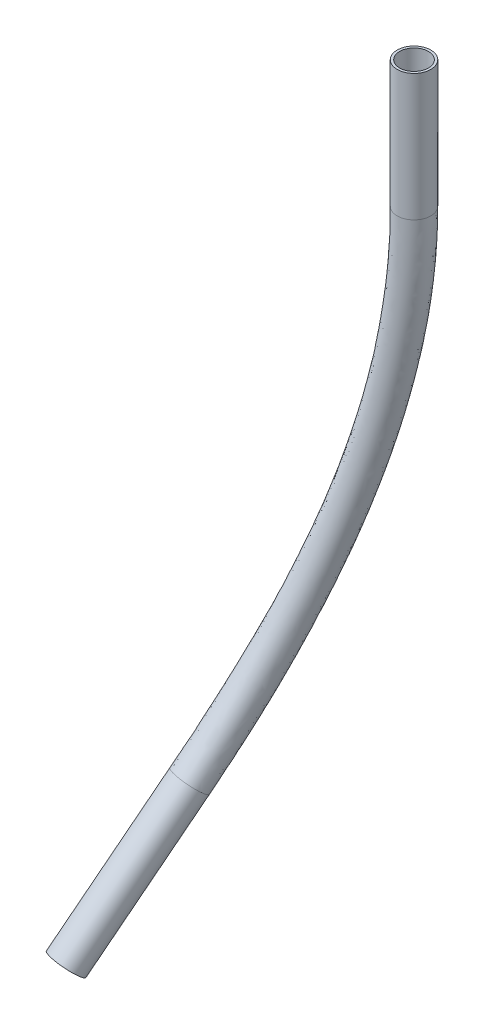
ISO-10303-21;
HEADER;
FILE_DESCRIPTION(('STEP AP214'),'2;1');
FILE_NAME('part.step','',(''),(''),'','','');
FILE_SCHEMA(('AUTOMOTIVE_DESIGN { 1 0 10303 214 1 1 1 1 }'));
ENDSEC;
DATA;
#1=APPLICATION_CONTEXT('core data for automotive mechanical design processes');
#2=APPLICATION_PROTOCOL_DEFINITION('international standard','automotive_design',2000,#1);
#3=PRODUCT_CONTEXT('',#1,'mechanical');
#4=PRODUCT('Part','Part','',(#3));
#5=PRODUCT_RELATED_PRODUCT_CATEGORY('part','',(#4));
#6=PRODUCT_DEFINITION_FORMATION('','',#4);
#7=PRODUCT_DEFINITION_CONTEXT('part definition',#1,'design');
#8=PRODUCT_DEFINITION('design','',#6,#7);
#9=PRODUCT_DEFINITION_SHAPE('','',#8);
#10=(LENGTH_UNIT() NAMED_UNIT(*) SI_UNIT(.MILLI.,.METRE.));
#11=(NAMED_UNIT(*) PLANE_ANGLE_UNIT() SI_UNIT($,.RADIAN.));
#12=(NAMED_UNIT(*) SI_UNIT($,.STERADIAN.) SOLID_ANGLE_UNIT());
#13=UNCERTAINTY_MEASURE_WITH_UNIT(LENGTH_MEASURE(1.E-05),#10,'distance_accuracy_value','');
#14=(GEOMETRIC_REPRESENTATION_CONTEXT(3) GLOBAL_UNCERTAINTY_ASSIGNED_CONTEXT((#13)) GLOBAL_UNIT_ASSIGNED_CONTEXT((#10,
#11,#12)) REPRESENTATION_CONTEXT('',''));
#15=CARTESIAN_POINT('',(0.,0.,0.));
#16=DIRECTION('',(0.,0.,1.));
#17=DIRECTION('',(1.,0.,0.));
#18=AXIS2_PLACEMENT_3D('',#15,#16,#17);
#19=CARTESIAN_POINT('',(-25.4518355396997,26.7082026198357,-24.3345169161758));
#20=DIRECTION('',(0.154747082057597,0.766044443118977,-0.623882402189063));
#21=DIRECTION('',(0.,-0.63148924671694,-0.775384634411123));
#22=AXIS2_PLACEMENT_3D('',#19,#20,#21);
#23=CYLINDRICAL_SURFACE('',#22,0.53213);
#24=CARTESIAN_POINT('',(-25.2189271106867,27.8611691600034,-25.2735166585337));
#25=DIRECTION('',(-0.154747082057597,-0.766044443118977,0.623882402189063));
#26=DIRECTION('',(0.,-0.63148924671694,-0.775384634411123));
#27=AXIS2_PLACEMENT_3D('',#24,#25,#26);
#28=CIRCLE('',#27,0.53213);
#29=CARTESIAN_POINT('',(-25.2189271106867,27.525134787148,-25.6861220840429));
#30=VERTEX_POINT('',#29);
#31=EDGE_CURVE('E42',#30,#30,#28,.F.);
#32=ORIENTED_EDGE('',*,*,#31,.T.);
#33=EDGE_LOOP('',(#32));
#34=FACE_BOUND('',#33,.T.);
#35=CARTESIAN_POINT('',(-23.930062277599,31.6959375525582,-28.2595744534185));
#36=CARTESIAN_POINT('',(-23.9282613133762,31.6900721088952,-28.2663297274114));
#37=CARTESIAN_POINT('',(-23.9266839689285,31.6842045714282,-28.2731430387115));
#38=CARTESIAN_POINT('',(-23.923997563247,31.6725423556797,-28.2867963523781));
#39=CARTESIAN_POINT('',(-23.9228837520355,31.6667475600735,-28.2936353206246));
#40=CARTESIAN_POINT('',(-23.9211156868814,31.6552381836464,-28.3073287521148));
#41=CARTESIAN_POINT('',(-23.9204572144324,31.6495233606438,-28.3141824663716));
#42=CARTESIAN_POINT('',(-23.9195905502066,31.6381813372569,-28.3278939930938));
#43=CARTESIAN_POINT('',(-23.9193786519351,31.6325538035448,-28.3347512954867));
#44=CARTESIAN_POINT('',(-23.9193960390649,31.6213937083077,-28.3484587177808));
#45=CARTESIAN_POINT('',(-23.9196220978129,31.6158607528798,-28.355308521007));
#46=CARTESIAN_POINT('',(-23.9205062960174,31.6048971403361,-28.3689896915733));
#47=CARTESIAN_POINT('',(-23.9211616542646,31.5994660546623,-28.3758208952778));
#48=CARTESIAN_POINT('',(-23.9228953963299,31.5887134809121,-28.3894536582254));
#49=CARTESIAN_POINT('',(-23.9239714074073,31.5833915513149,-28.3962551710652));
#50=CARTESIAN_POINT('',(-23.9265374361815,31.5728645687016,-28.4098173776115));
#51=CARTESIAN_POINT('',(-23.9280254520575,31.5676590788799,-28.4165781111274));
#52=CARTESIAN_POINT('',(-23.9314065113993,31.5573722380025,-28.4300476148822));
#53=CARTESIAN_POINT('',(-23.9332978870446,31.5522904689683,-28.4367564846585));
#54=CARTESIAN_POINT('',(-23.9374767248168,31.5422583187773,-28.450111142249));
#55=CARTESIAN_POINT('',(-23.9397628179298,31.5373075495392,-28.4567570670066));
#56=CARTESIAN_POINT('',(-23.9447221856284,31.5275446379431,-28.4699747372408));
#57=CARTESIAN_POINT('',(-23.9473943573581,31.5227321460153,-28.4765466383915));
#58=CARTESIAN_POINT('',(-23.9531170104835,31.5132530203317,-28.489605181796));
#59=CARTESIAN_POINT('',(-23.9561666256673,31.5085860822851,-28.4960919828242));
#60=CARTESIAN_POINT('',(-23.9626353237617,31.4994052897012,-28.5089692610885));
#61=CARTESIAN_POINT('',(-23.9660537510958,31.4948911816795,-28.5153598869611));
#62=CARTESIAN_POINT('',(-23.9732512577515,31.4860232696688,-28.5280337624273));
#63=CARTESIAN_POINT('',(-23.9770298698093,31.4816692678752,-28.5343171389991));
#64=CARTESIAN_POINT('',(-23.9849389525844,31.473128784582,-28.5467654741697));
#65=CARTESIAN_POINT('',(-23.9890691257289,31.4689421657304,-28.5529305276089));
#66=CARTESIAN_POINT('',(-23.9976725560024,31.4607436603178,-28.5651311846831));
#67=CARTESIAN_POINT('',(-24.0021456702033,31.4567317020446,-28.5711668409194));
#68=CARTESIAN_POINT('',(-24.0114262229725,31.4488897250102,-28.5830976813551));
#69=CARTESIAN_POINT('',(-24.0162336615408,31.445059706249,-28.5889928655545));
#70=CARTESIAN_POINT('',(-24.0261741151674,31.4375888097102,-28.6006317496555));
#71=CARTESIAN_POINT('',(-24.0313072644159,31.4339480110282,-28.6063753857226));
#72=CARTESIAN_POINT('',(-24.0418904003217,31.4268627489788,-28.6177001722475));
#73=CARTESIAN_POINT('',(-24.0473406491539,31.4234184528743,-28.6232811823583));
#74=CARTESIAN_POINT('',(-24.0585492514655,31.4167333814147,-28.6342697281501));
#75=CARTESIAN_POINT('',(-24.0643079908945,31.4134928725741,-28.6396770323173));
#76=CARTESIAN_POINT('',(-24.0761248460329,31.4072225501135,-28.6503071919531));
#77=CARTESIAN_POINT('',(-24.0821834686269,31.4041931156212,-28.6555297076305));
#78=CARTESIAN_POINT('',(-24.094591364837,31.3983521030498,-28.6657793330938));
#79=CARTESIAN_POINT('',(-24.1009412640901,31.3955410325448,-28.6708059748284));
#80=CARTESIAN_POINT('',(-24.1139229909064,31.3901438933699,-28.6806529152085));
#81=CARTESIAN_POINT('',(-24.1205555605328,31.3875584791359,-28.6854725943544));
#82=CARTESIAN_POINT('',(-24.1340939081763,31.382619779576,-28.6948946955825));
#83=CARTESIAN_POINT('',(-24.1410005413301,31.3802673165525,-28.6994963200939));
#84=CARTESIAN_POINT('',(-24.1550783000408,31.3758016255784,-28.708471424726));
#85=CARTESIAN_POINT('',(-24.1622503884749,31.3736894112764,-28.7128438990523));
#86=CARTESIAN_POINT('',(-24.1768503477705,31.3697113005897,-28.7213498461126));
#87=CARTESIAN_POINT('',(-24.1842792809324,31.3678466348964,-28.7254820712133));
#88=CARTESIAN_POINT('',(-24.1993842288562,31.3643706788322,-28.7334966961262));
#89=CARTESIAN_POINT('',(-24.2070613930192,31.3627608636904,-28.7373775696498));
#90=CARTESIAN_POINT('',(-24.2226541152021,31.3598016390377,-28.7448787042288));
#91=CARTESIAN_POINT('',(-24.2305708924026,31.3584539779913,-28.7484971208069));
#92=CARTESIAN_POINT('',(-24.2466341716963,31.3560260637141,-28.7554625935052));
#93=CARTESIAN_POINT('',(-24.2547819395292,31.354947861308,-28.7588074454386));
#94=CARTESIAN_POINT('',(-24.2712985534968,31.3530658381929,-28.7652150811599));
#95=CARTESIAN_POINT('',(-24.279668682043,31.3522643992721,-28.7682752585171));
#96=CARTESIAN_POINT('',(-24.296621408715,31.3509428493999,-28.7741028806916));
#97=CARTESIAN_POINT('',(-24.3052052689561,31.3504254781825,-28.7768672745344));
#98=CARTESIAN_POINT('',(-24.3225768617204,31.3496789846291,-28.7820926992586));
#99=CARTESIAN_POINT('',(-24.3313657914057,31.3494529841308,-28.7845501938821));
#100=CARTESIAN_POINT('',(-24.3490345374274,31.3492970519659,-28.7891241934834));
#101=CARTESIAN_POINT('',(-24.3579143537638,31.3493671202993,-28.7912406984612));
#102=CARTESIAN_POINT('',(-24.3756491514644,31.3498037890663,-28.7951034464794));
#103=CARTESIAN_POINT('',(-24.3845034120282,31.3501672634579,-28.7968533490961));
#104=CARTESIAN_POINT('',(-24.40217371256,31.3511832543742,-28.7999887689186));
#105=CARTESIAN_POINT('',(-24.4109893302912,31.3518330237527,-28.8013775545225));
#106=CARTESIAN_POINT('',(-24.4285690510586,31.3534141361364,-28.8037966131966));
#107=CARTESIAN_POINT('',(-24.4373329712136,31.3543430876497,-28.8048297773386));
#108=CARTESIAN_POINT('',(-24.4547960547394,31.3564751213744,-28.8065434474601));
#109=CARTESIAN_POINT('',(-24.4634952212953,31.3576761415626,-28.8072264861195));
#110=CARTESIAN_POINT('',(-24.48081561043,31.3603448977976,-28.8082457387745));
#111=CARTESIAN_POINT('',(-24.4894369750209,31.361810873367,-28.8085841496262));
#112=CARTESIAN_POINT('',(-24.5065886189907,31.365002155001,-28.8089199553709));
#113=CARTESIAN_POINT('',(-24.5151191382809,31.3667259735755,-28.8089192362108));
#114=CARTESIAN_POINT('',(-24.5320759904085,31.3704255856118,-28.8085825640211));
#115=CARTESIAN_POINT('',(-24.5405026262568,31.372400136333,-28.8082482120698));
#116=CARTESIAN_POINT('',(-24.5572386437664,31.3765938861729,-28.8072500289449));
#117=CARTESIAN_POINT('',(-24.5655483624472,31.378812060171,-28.8065875400766));
#118=CARTESIAN_POINT('',(-24.582037505642,31.3834857578092,-28.804938810595));
#119=CARTESIAN_POINT('',(-24.5902172771778,31.3859404485372,-28.8039536787616));
#120=CARTESIAN_POINT('',(-24.6064335087513,31.3910799066716,-28.8016653647756));
#121=CARTESIAN_POINT('',(-24.6144703061327,31.3937640101157,-28.8003630815546));
#122=CARTESIAN_POINT('',(-24.6303875904449,31.399355044182,-28.7974461419683));
#123=CARTESIAN_POINT('',(-24.6382683888456,31.4022614589597,-28.7958321962478));
#124=CARTESIAN_POINT('',(-24.6538606912337,31.4082898871022,-28.7922975868816));
#125=CARTESIAN_POINT('',(-24.6615724672279,31.4114115144654,-28.7903774646626));
#126=CARTESIAN_POINT('',(-24.6768137533491,31.4178631574543,-28.7862361381923));
#127=CARTESIAN_POINT('',(-24.6843434841541,31.4211929012118,-28.7840153224955));
#128=CARTESIAN_POINT('',(-24.6992077193704,31.4280535823168,-28.7792782284545));
#129=CARTESIAN_POINT('',(-24.7065423821253,31.4315843486901,-28.776762199319));
#130=CARTESIAN_POINT('',(-24.7210035309305,31.4388398935176,-28.7714402841561));
#131=CARTESIAN_POINT('',(-24.7281301020159,31.4425645909414,-28.7686345187152));
#132=CARTESIAN_POINT('',(-24.7421621275035,31.4502008272406,-28.7627387259009));
#133=CARTESIAN_POINT('',(-24.7490675819058,31.454112366116,-28.7596486985275));
#134=CARTESIAN_POINT('',(-24.7626444452746,31.4621151235564,-28.7531899687045));
#135=CARTESIAN_POINT('',(-24.7693157559947,31.4662064159621,-28.7498211512194));
#136=CARTESIAN_POINT('',(-24.7824114160891,31.4745615258834,-28.7428104223958));
#137=CARTESIAN_POINT('',(-24.788835553599,31.4788254852469,-28.7391682843362));
#138=CARTESIAN_POINT('',(-24.8014239664818,31.4875187803797,-28.7316164921219));
#139=CARTESIAN_POINT('',(-24.8075878982312,31.4919483211099,-28.7277065010704));
#140=CARTESIAN_POINT('',(-24.8196430167888,31.5009656352654,-28.7196245789608));
#141=CARTESIAN_POINT('',(-24.825533706771,31.5055536723454,-28.7154522009377));
#142=CARTESIAN_POINT('',(-24.8370294803554,31.5148808400717,-28.7068510806468));
#143=CARTESIAN_POINT('',(-24.8426338887431,31.5196202886123,-28.7024217805677));
#144=CARTESIAN_POINT('',(-24.8535442628565,31.5292431448141,-28.6933123924168));
#145=CARTESIAN_POINT('',(-24.8588493457267,31.5341269195695,-28.6886316346196));
#146=CARTESIAN_POINT('',(-24.8691482617601,31.5440312990909,-28.6790249079843));
#147=CARTESIAN_POINT('',(-24.8741409709286,31.5490523139398,-28.6740981568247));
#148=CARTESIAN_POINT('',(-24.8838023659708,31.5592240511147,-28.6640050206404));
#149=CARTESIAN_POINT('',(-24.8884696489638,31.564375218519,-28.6588377411499));
#150=CARTESIAN_POINT('',(-24.8974674556942,31.5748001466839,-28.6482691244826));
#151=CARTESIAN_POINT('',(-24.9017962558823,31.5800743771274,-28.6428667830906));
#152=CARTESIAN_POINT('',(-24.9101044025797,31.5907383281421,-28.6318336157283));
#153=CARTESIAN_POINT('',(-24.9140816595147,31.5961285296157,-28.6262016809782));
#154=CARTESIAN_POINT('',(-24.9216740701609,31.6070173332761,-28.614714894177));
#155=CARTESIAN_POINT('',(-24.9252867200845,31.6125164106607,-28.6088588376097));
#156=CARTESIAN_POINT('',(-24.9321373147303,31.6236158945087,-28.5969293644183));
#157=CARTESIAN_POINT('',(-24.935372291474,31.6292167495533,-28.5908546608224));
#158=CARTESIAN_POINT('',(-24.9414549863139,31.6405127372822,-28.5784934380587));
#159=CARTESIAN_POINT('',(-24.9442992218125,31.6462082667029,-28.5722055679322));
#160=CARTESIAN_POINT('',(-24.9495879311047,31.6576865820695,-28.5594235318559));
#161=CARTESIAN_POINT('',(-24.9520283584445,31.6634696832976,-28.5529279751039));
#162=CARTESIAN_POINT('',(-24.9564969902088,31.6751161335498,-28.5397360806979));
#163=CARTESIAN_POINT('',(-24.9585205380429,31.6809796822367,-28.5330383428692));
#164=CARTESIAN_POINT('',(-24.9621217083539,31.69271071504,-28.5195274282099));
#165=CARTESIAN_POINT('',(-24.9636993308308,31.6985781991565,-28.5127142513793));
#166=CARTESIAN_POINT('',(-24.9663859375261,31.7102403763328,-28.4990610349334));
#167=CARTESIAN_POINT('',(-24.967499675425,31.7160351860068,-28.4922220312291));
#168=CARTESIAN_POINT('',(-24.9692676875034,31.7275445726185,-28.4785285740687));
#169=CARTESIAN_POINT('',(-24.9699261793171,31.7332593919052,-28.4716748691778));
#170=CARTESIAN_POINT('',(-24.97079285758,31.7446014125985,-28.4579633492446));
#171=CARTESIAN_POINT('',(-24.9710047507282,31.7502289472937,-28.4511060443738));
#172=CARTESIAN_POINT('',(-24.9709873598803,31.7613890432443,-28.4373986202814));
#173=CARTESIAN_POINT('',(-24.9707613024897,31.7669219984118,-28.4305488177118));
#174=CARTESIAN_POINT('',(-24.9698771052715,31.7778856107662,-28.4168676476225));
#175=CARTESIAN_POINT('',(-24.9692217466641,31.7833166965091,-28.4100364437438));
#176=CARTESIAN_POINT('',(-24.9674880043369,31.7940692703096,-28.3964036806695));
#177=CARTESIAN_POINT('',(-24.9664119933552,31.7993911998884,-28.3896021678759));
#178=CARTESIAN_POINT('',(-24.9638459646507,31.8099181824884,-28.3760399613634));
#179=CARTESIAN_POINT('',(-24.9623579487491,31.8151236723149,-28.3692792278352));
#180=CARTESIAN_POINT('',(-24.9589768893888,31.8254105131959,-28.3558097240714));
#181=CARTESIAN_POINT('',(-24.9570855137503,31.8304922822288,-28.3491008542983));
#182=CARTESIAN_POINT('',(-24.9529066759831,31.8405244324188,-28.3357461967103));
#183=CARTESIAN_POINT('',(-24.9506205828682,31.8454752016573,-28.3291002719517));
#184=CARTESIAN_POINT('',(-24.9456612151684,31.8552381132536,-28.3158826017169));
#185=CARTESIAN_POINT('',(-24.9429890434391,31.8600506051814,-28.3093107005665));
#186=CARTESIAN_POINT('',(-24.9372663903141,31.8695297308649,-28.2962521571621));
#187=CARTESIAN_POINT('',(-24.9342167751302,31.8741966689115,-28.2897653561338));
#188=CARTESIAN_POINT('',(-24.9277480770357,31.8833774614954,-28.2768880778695));
#189=CARTESIAN_POINT('',(-24.9243296497015,31.8878915695172,-28.2704974519969));
#190=CARTESIAN_POINT('',(-24.9171321430459,31.8967594815278,-28.2578235765308));
#191=CARTESIAN_POINT('',(-24.913353530988,31.9011134833214,-28.251540199959));
#192=CARTESIAN_POINT('',(-24.905444448213,31.9096539666146,-28.2390918647884));
#193=CARTESIAN_POINT('',(-24.9013142750684,31.9138405854662,-28.2329268113492));
#194=CARTESIAN_POINT('',(-24.892710844795,31.9220390908788,-28.220726154275));
#195=CARTESIAN_POINT('',(-24.8882377305941,31.926051049152,-28.2146904980386));
#196=CARTESIAN_POINT('',(-24.8789571778249,31.9338930261864,-28.2027596576029));
#197=CARTESIAN_POINT('',(-24.8741497392565,31.9377230449476,-28.1968644734036));
#198=CARTESIAN_POINT('',(-24.86420928563,31.9451939414864,-28.1852255893026));
#199=CARTESIAN_POINT('',(-24.8590761363815,31.9488347401684,-28.1794819532355));
#200=CARTESIAN_POINT('',(-24.8484930004757,31.9559200022178,-28.1681571667106));
#201=CARTESIAN_POINT('',(-24.8430427516435,31.9593642983223,-28.1625761565998));
#202=CARTESIAN_POINT('',(-24.8318341493319,31.9660493697819,-28.151587610808));
#203=CARTESIAN_POINT('',(-24.8260754099029,31.9692898786226,-28.1461803066407));
#204=CARTESIAN_POINT('',(-24.8142585547645,31.9755602010831,-28.135550147005));
#205=CARTESIAN_POINT('',(-24.8081999321704,31.9785896355754,-28.1303276313275));
#206=CARTESIAN_POINT('',(-24.7957920359603,31.9844306481468,-28.1200780058643));
#207=CARTESIAN_POINT('',(-24.7894421367072,31.9872417186518,-28.1150513641297));
#208=CARTESIAN_POINT('',(-24.776460409891,31.9926388578268,-28.1052044237495));
#209=CARTESIAN_POINT('',(-24.7698278402646,31.9952242720607,-28.1003847446037));
#210=CARTESIAN_POINT('',(-24.7562894926211,32.0001629716207,-28.0909626433756));
#211=CARTESIAN_POINT('',(-24.7493828594673,32.0025154346441,-28.0863610188641));
#212=CARTESIAN_POINT('',(-24.7353051007566,32.0069811256182,-28.077385914232));
#213=CARTESIAN_POINT('',(-24.7281330123225,32.0090933399202,-28.0730134399058));
#214=CARTESIAN_POINT('',(-24.7135330530269,32.013071450607,-28.0645074928455));
#215=CARTESIAN_POINT('',(-24.706104119865,32.0149361163002,-28.0603752677448));
#216=CARTESIAN_POINT('',(-24.6909991719412,32.0184120723644,-28.0523606428319));
#217=CARTESIAN_POINT('',(-24.6833220077782,32.0200218875062,-28.0484797693083));
#218=CARTESIAN_POINT('',(-24.6677292855952,32.0229811121589,-28.0409786347293));
#219=CARTESIAN_POINT('',(-24.6598125083948,32.0243287732053,-28.0373602181511));
#220=CARTESIAN_POINT('',(-24.6437492291011,32.0267566874825,-28.0303947454528));
#221=CARTESIAN_POINT('',(-24.6356014612682,32.0278348898886,-28.0270498935195));
#222=CARTESIAN_POINT('',(-24.6190848473006,32.0297169130037,-28.0206422577982));
#223=CARTESIAN_POINT('',(-24.6107147187544,32.0305183519245,-28.017582080441));
#224=CARTESIAN_POINT('',(-24.5937619920824,32.0318399017967,-28.0117544582665));
#225=CARTESIAN_POINT('',(-24.5851781318413,32.0323572730141,-28.0089900644237));
#226=CARTESIAN_POINT('',(-24.567806539077,32.0331037665676,-28.0037646396994));
#227=CARTESIAN_POINT('',(-24.5590176093917,32.0333297670659,-28.001307145076));
#228=CARTESIAN_POINT('',(-24.54134886337,32.0334856992307,-27.9967331454747));
#229=CARTESIAN_POINT('',(-24.5324690470336,32.0334156308973,-27.9946166404968));
#230=CARTESIAN_POINT('',(-24.514734249333,32.0329789621304,-27.9907538924786));
#231=CARTESIAN_POINT('',(-24.5058799887692,32.0326154877387,-27.9890039898619));
#232=CARTESIAN_POINT('',(-24.4882096882374,32.0315994968224,-27.9858685700395));
#233=CARTESIAN_POINT('',(-24.4793940705062,32.0309497274439,-27.9844797844356));
#234=CARTESIAN_POINT('',(-24.4618143497388,32.0293686150602,-27.9820607257614));
#235=CARTESIAN_POINT('',(-24.4530504295837,32.0284396635469,-27.9810275616195));
#236=CARTESIAN_POINT('',(-24.435587346058,32.0263076298222,-27.979313891498));
#237=CARTESIAN_POINT('',(-24.4268881795021,32.025106609634,-27.9786308528386));
#238=CARTESIAN_POINT('',(-24.4095677903674,32.022437853399,-27.9776116001836));
#239=CARTESIAN_POINT('',(-24.4009464257765,32.0209718778296,-27.9772731893318));
#240=CARTESIAN_POINT('',(-24.3837947818067,32.0177805961956,-27.9769373835872));
#241=CARTESIAN_POINT('',(-24.3752642625165,32.0160567776212,-27.9769381027472));
#242=CARTESIAN_POINT('',(-24.3583074103889,32.0123571655848,-27.977274774937));
#243=CARTESIAN_POINT('',(-24.3498807745406,32.0103826148636,-27.9776091268883));
#244=CARTESIAN_POINT('',(-24.333144757031,32.0061888650237,-27.9786073100132));
#245=CARTESIAN_POINT('',(-24.3248350383501,32.0039706910256,-27.9792697988814));
#246=CARTESIAN_POINT('',(-24.3083458951554,31.9992969933875,-27.980918528363));
#247=CARTESIAN_POINT('',(-24.3001661236196,31.9968423026594,-27.9819036601965));
#248=CARTESIAN_POINT('',(-24.2839498920461,31.991702844525,-27.9841919741825));
#249=CARTESIAN_POINT('',(-24.2759130946647,31.9890187410809,-27.9854942574035));
#250=CARTESIAN_POINT('',(-24.2599958103525,31.9834277070146,-27.9884111969898));
#251=CARTESIAN_POINT('',(-24.2521150119518,31.9805212922369,-27.9900251427102));
#252=CARTESIAN_POINT('',(-24.2365227095636,31.9744928640944,-27.9935597520764));
#253=CARTESIAN_POINT('',(-24.2288109335695,31.9713712367312,-27.9954798742955));
#254=CARTESIAN_POINT('',(-24.2135696474483,31.9649195937423,-27.9996212007658));
#255=CARTESIAN_POINT('',(-24.2060399166433,31.9615898499848,-28.0018420164625));
#256=CARTESIAN_POINT('',(-24.191175681427,31.9547291688798,-28.0065791105036));
#257=CARTESIAN_POINT('',(-24.1838410186721,31.9511984025065,-28.0090951396391));
#258=CARTESIAN_POINT('',(-24.1693798698669,31.943942857679,-28.014417054802));
#259=CARTESIAN_POINT('',(-24.1622532987815,31.9402181602553,-28.0172228202429));
#260=CARTESIAN_POINT('',(-24.1482212732939,31.932581923956,-28.0231186130572));
#261=CARTESIAN_POINT('',(-24.1413158188916,31.9286703850806,-28.0262086404306));
#262=CARTESIAN_POINT('',(-24.1277389555228,31.9206676276402,-28.0326673702536));
#263=CARTESIAN_POINT('',(-24.1210676448027,31.9165763352345,-28.0360361877387));
#264=CARTESIAN_POINT('',(-24.1079719847083,31.9082212253132,-28.0430469165623));
#265=CARTESIAN_POINT('',(-24.1015478471984,31.9039572659497,-28.0466890546219));
#266=CARTESIAN_POINT('',(-24.0889594343156,31.895263970817,-28.0542408468362));
#267=CARTESIAN_POINT('',(-24.0827955025661,31.8908344300867,-28.0581508378876));
#268=CARTESIAN_POINT('',(-24.0707403840086,31.8818171159312,-28.0662327599972));
#269=CARTESIAN_POINT('',(-24.0648496940266,31.8772290788513,-28.0704051380204));
#270=CARTESIAN_POINT('',(-24.0533539204418,31.8679019111249,-28.0790062583112));
#271=CARTESIAN_POINT('',(-24.0477495120536,31.8631624625842,-28.0834355583903));
#272=CARTESIAN_POINT('',(-24.0368391379416,31.8535396063827,-28.0925449465413));
#273=CARTESIAN_POINT('',(-24.0315340550734,31.8486558316275,-28.0972257043387));
#274=CARTESIAN_POINT('',(-24.0212351390345,31.8387514521053,-28.1068324309736));
#275=CARTESIAN_POINT('',(-24.0162424298585,31.8337304372552,-28.1117591821328));
#276=CARTESIAN_POINT('',(-24.006581034837,31.8235587000836,-28.1218523183182));
#277=CARTESIAN_POINT('',(-24.0019137518722,31.8184075326837,-28.1270195978104));
#278=CARTESIAN_POINT('',(-23.9929159450644,31.8079826045067,-28.1375882144733));
#279=CARTESIAN_POINT('',(-23.9885871447699,31.8027083740466,-28.1429905558592));
#280=CARTESIAN_POINT('',(-23.9802789983638,31.7920444230773,-28.154023723238));
#281=CARTESIAN_POINT('',(-23.9763017418294,31.786654221666,-28.1596556580109));
#282=CARTESIAN_POINT('',(-23.9687093300863,31.7757654178348,-28.1711424447499));
#283=CARTESIAN_POINT('',(-23.9650966786531,31.7702663402151,-28.1769985012315));
#284=CARTESIAN_POINT('',(-23.9582460881421,31.7591668570112,-28.1889279746575));
#285=CARTESIAN_POINT('',(-23.9550111170959,31.7535660028541,-28.1950026785768));
#286=CARTESIAN_POINT('',(-23.9489284066456,31.7422700126933,-28.2073639004545));
#287=CARTESIAN_POINT('',(-23.9460841496118,31.7365744799178,-28.2136517693588));
#288=CARTESIAN_POINT('',(-23.9407954993444,31.7250961737464,-28.226433808785));
#289=CARTESIAN_POINT('',(-23.9383551535347,31.7193130852196,-28.2329293701641));
#290=CARTESIAN_POINT('',(-23.9338862982252,31.7076666001421,-28.2461212518832));
#291=CARTESIAN_POINT('',(-23.9318624411979,31.7018030032871,-28.252818972164));
#292=CARTESIAN_POINT('',(-23.930062277599,31.6959375525582,-28.2595744534185));
#293=B_SPLINE_CURVE_WITH_KNOTS('',3,(#35,#36,#37,#38,#39,#40,#41,#42,#43,#44,#45,#46,#47,#48,
#49,#50,#51,#52,#53,#54,#55,#56,#57,#58,#59,#60,#61,#62,#63,#64,#65,#66,#67,#68,#69,#70,#71,#72,
#73,#74,#75,#76,#77,#78,#79,#80,#81,#82,#83,#84,#85,#86,#87,#88,#89,#90,#91,#92,#93,#94,#95,#96,
#97,#98,#99,#100,#101,#102,#103,#104,#105,#106,#107,#108,#109,#110,#111,#112,#113,#114,#115,
#116,#117,#118,#119,#120,#121,#122,#123,#124,#125,#126,#127,#128,#129,#130,#131,#132,#133,#134,
#135,#136,#137,#138,#139,#140,#141,#142,#143,#144,#145,#146,#147,#148,#149,#150,#151,#152,#153,
#154,#155,#156,#157,#158,#159,#160,#161,#162,#163,#164,#165,#166,#167,#168,#169,#170,#171,#172,
#173,#174,#175,#176,#177,#178,#179,#180,#181,#182,#183,#184,#185,#186,#187,#188,#189,#190,#191,
#192,#193,#194,#195,#196,#197,#198,#199,#200,#201,#202,#203,#204,#205,#206,#207,#208,#209,#210,
#211,#212,#213,#214,#215,#216,#217,#218,#219,#220,#221,#222,#223,#224,#225,#226,#227,#228,#229,
#230,#231,#232,#233,#234,#235,#236,#237,#238,#239,#240,#241,#242,#243,#244,#245,#246,#247,#248,
#249,#250,#251,#252,#253,#254,#255,#256,#257,#258,#259,#260,#261,#262,#263,#264,#265,#266,#267,
#268,#269,#270,#271,#272,#273,#274,#275,#276,#277,#278,#279,#280,#281,#282,#283,#284,#285,#286,
#287,#288,#289,#290,#291,#292),.UNSPECIFIED.,.F.,.F.,(4,2,2,2,2,2,2,2,2,2,2,2,2,2,2,2,2,2,2,2,2,
2,2,2,2,2,2,2,2,2,2,2,2,2,2,2,2,2,2,2,2,2,2,2,2,2,2,2,2,2,2,2,2,2,2,2,2,2,2,2,2,2,2,2,2,2,2,2,2,
2,2,2,2,2,2,2,2,2,2,2,2,2,2,2,2,2,2,2,2,2,2,2,2,2,2,2,2,2,2,2,2,2,2,2,2,2,2,2,2,2,2,2,2,2,2,2,2,
2,2,2,2,2,2,2,2,2,2,2,4),(0.,0.027374800948431,0.0544617320112323,0.081294225959957,
0.10790312293546,0.134316723902244,0.160560875015826,0.186659080652083,0.212632642421725,
0.238500821242432,0.264281019447257,0.289988979944415,0.315638999578796,0.341244154045962,
0.366816531943383,0.392367475782587,0.417907828005346,0.443448180228108,0.468999124067316,
0.494571501964731,0.5201766564319,0.545826676066286,0.571534636563436,0.597314834768268,
0.623183013588974,0.649156575358616,0.675254780994875,0.701498932108456,0.727912533075241,
0.754521430050746,0.781353923999474,0.808440855062268,0.835815656010696,0.863190456959127,
0.890277388021921,0.917109881970651,0.943718778946162,0.970132379912938,0.99637653102652,
1.02247473666278,1.04844829843243,1.07431647725313,1.10009667545795,1.12580463595511,
1.1514546555895,1.17705981005666,1.20263218795408,1.22818313179329,1.25372348401604,
1.27926383623881,1.30481478007801,1.33038715797543,1.3559923124426,1.38164233207698,
1.40735029257414,1.43313049077896,1.45899866959966,1.48497223136931,1.51107043700557,
1.53731458811915,1.56372818908593,1.59033708606144,1.61716958001016,1.64425651107296,
1.67163131202139,1.69900611296982,1.72609304403262,1.75292553798134,1.77953443495685,
1.80594803592363,1.83219218703722,1.85829039267348,1.88426395444312,1.91013213326382,
1.93591233146865,1.9616202919658,1.98727031160019,2.01287546606735,2.03844784396477,
2.06399878780398,2.08953914002674,2.1150794922495,2.14063043608871,2.16620281398613,
2.19180796845329,2.21745798808767,2.24316594858483,2.26894614678965,2.29481432561036,
2.32078788738,2.34688609301626,2.37313024412984,2.39954384509663,2.42615274207214,
2.45298523602086,2.48007216708366,2.50744696803209,2.53482176898052,2.56190870004332,
2.58874119399205,2.61535009096755,2.64176369193433,2.66800784304791,2.69410604868417,
2.72007961045382,2.74594778927453,2.77172798747935,2.79743594797651,2.82308596761089,
2.84869112207806,2.87426349997548,2.89981444381468,2.92535479603744,2.9508951482602,
2.9764460920994,3.00201846999683,3.02762362446399,3.05327364409837,3.07898160459554,
3.10476180280036,3.13062998162106,3.1566035433907,3.18270174902697,3.20894590014055,
3.23535950110733,3.26196839808284,3.28880089203156,3.31588782309437,3.34326262404279),.UNSPECIFIED.);
#294=CARTESIAN_POINT('',(-23.930062277599,31.6959375525582,-28.2595744534185));
#295=VERTEX_POINT('',#294);
#296=EDGE_CURVE('E47',#295,#295,#293,.F.);
#297=ORIENTED_EDGE('',*,*,#296,.T.);
#298=EDGE_LOOP('',(#297));
#299=FACE_BOUND('',#298,.T.);
#300=ADVANCED_FACE('F33',(#34,#299),#23,.T.);
#301=CARTESIAN_POINT('',(-25.4518355396997,26.7082026198357,-24.3345169161758));
#302=DIRECTION('',(0.154747082057597,0.766044443118977,-0.623882402189063));
#303=DIRECTION('',(0.,-0.63148924671694,-0.775384634411123));
#304=AXIS2_PLACEMENT_3D('',#301,#302,#303);
#305=CYLINDRICAL_SURFACE('',#304,0.455929999999999);
#306=CARTESIAN_POINT('',(-25.2189271106867,27.8611691600034,-25.2735166585337));
#307=DIRECTION('',(-0.154747082057597,-0.766044443118977,0.623882402189063));
#308=DIRECTION('',(0.,-0.63148924671694,-0.775384634411123));
#309=AXIS2_PLACEMENT_3D('',#306,#307,#308);
#310=CIRCLE('',#309,0.455929999999999);
#311=CARTESIAN_POINT('',(-25.2189271106867,27.5732542677478,-25.6270377749008));
#312=VERTEX_POINT('',#311);
#313=EDGE_CURVE('E10',#312,#312,#310,.F.);
#314=ORIENTED_EDGE('',*,*,#313,.F.);
#315=EDGE_LOOP('',(#314));
#316=FACE_BOUND('',#315,.T.);
#317=CARTESIAN_POINT('',(-24.4451917003987,31.6913913755983,-28.392928669479));
#318=DIRECTION('',(-0.154747082057597,-0.766044443118977,0.623882402189063));
#319=DIRECTION('',(0.,-0.63148924671694,-0.775384634411123));
#320=AXIS2_PLACEMENT_3D('',#317,#318,#319);
#321=CIRCLE('',#320,0.455929999999999);
#322=CARTESIAN_POINT('',(-24.4451917003987,31.4034764833427,-28.7464497858461));
#323=VERTEX_POINT('',#322);
#324=EDGE_CURVE('E55',#323,#323,#321,.F.);
#325=ORIENTED_EDGE('',*,*,#324,.T.);
#326=EDGE_LOOP('',(#325));
#327=FACE_BOUND('',#326,.T.);
#328=ADVANCED_FACE('F130',(#316,#327),#305,.F.);
#329=CARTESIAN_POINT('',(-28.3209149989652,26.832708984505,-27.3057422386274));
#330=DIRECTION('',(0.154747082057597,0.766044443118977,-0.623882402189063));
#331=DIRECTION('',(-0.970588718244434,0.,-0.240743722694126));
#332=AXIS2_PLACEMENT_3D('',#329,#330,#331);
#333=PLANE('',#332);
#334=ORIENTED_EDGE('',*,*,#31,.F.);
#335=EDGE_LOOP('',(#334));
#336=FACE_BOUND('',#335,.T.);
#337=ORIENTED_EDGE('',*,*,#313,.T.);
#338=EDGE_LOOP('',(#337));
#339=FACE_BOUND('',#338,.T.);
#340=ADVANCED_FACE('F135',(#336,#339),#333,.F.);
#341=CARTESIAN_POINT('',(-24.4451917003987,31.6913913755983,-28.392928669479));
#342=DIRECTION('',(0.154747082057597,0.766044443118977,-0.623882402189063));
#343=DIRECTION('',(0.,-0.63148924671694,-0.775384634411123));
#344=AXIS2_PLACEMENT_3D('',#341,#342,#343);
#345=PLANE('',#344);
#346=ORIENTED_EDGE('',*,*,#324,.F.);
#347=EDGE_LOOP('',(#346));
#348=FACE_BOUND('',#347,.T.);
#349=ADVANCED_FACE('F84',(#348),#345,.F.);
#350=CARTESIAN_POINT('',(-23.930062277599,31.6959375525583,-28.2595744534185));
#351=CARTESIAN_POINT('',(-23.1054914285864,35.7778104282545,-31.5839359548886));
#352=CARTESIAN_POINT('',(-21.0148585770968,41.6609171104009,-31.8855518660107));
#353=CARTESIAN_POINT('',(-21.0148585770968,46.9894237164625,-31.8855518660107));
#354=CARTESIAN_POINT('',(-23.9329595978302,31.7053757506268,-28.2487042520663));
#355=CARTESIAN_POINT('',(-23.1089061158705,35.7846875043252,-31.5709799229312));
#356=CARTESIAN_POINT('',(-21.0270929657193,41.6642604177258,-31.8775373646127));
#357=CARTESIAN_POINT('',(-21.0270929657193,46.9894237164625,-31.8775373646127));
#358=CARTESIAN_POINT('',(-23.9398538407377,31.7240644035697,-28.2274671171242));
#359=CARTESIAN_POINT('',(-23.1168209106186,35.7983241197365,-31.5456283043721));
#360=CARTESIAN_POINT('',(-21.0519822571602,41.6708553843454,-31.8626524132793));
#361=CARTESIAN_POINT('',(-21.0519822571602,46.9894237164625,-31.8626524132793));
#362=CARTESIAN_POINT('',(-23.953333902643,31.751447021561,-28.1971884908346));
#363=CARTESIAN_POINT('',(-23.1317489136238,35.8185389952487,-31.5095121206976));
#364=CARTESIAN_POINT('',(-21.0903882843421,41.6802122076257,-31.8437176585788));
#365=CARTESIAN_POINT('',(-21.0903882843421,46.9894237164625,-31.8437176585788));
#366=CARTESIAN_POINT('',(-23.9697925523005,31.7780921462891,-28.1685542135055));
#367=CARTESIAN_POINT('',(-23.1495792544738,35.8383938373964,-31.475347697114));
#368=CARTESIAN_POINT('',(-21.1296769489774,41.6890762920028,-31.8281360940892));
#369=CARTESIAN_POINT('',(-21.1296769489774,46.9894237164625,-31.8281360940892));
#370=CARTESIAN_POINT('',(-24.0854553180093,31.933015144037,-28.007018280313));
#371=CARTESIAN_POINT('',(-23.2729812922514,35.9550051184817,-31.28260991129));
#372=CARTESIAN_POINT('',(-21.3695680461065,41.7390886862008,-31.7545289558874));
#373=CARTESIAN_POINT('',(-21.3695680461065,46.9894237164625,-31.7545289558874));
#374=CARTESIAN_POINT('',(-24.3227371079839,32.0354150157899,-27.9401399904911));
#375=CARTESIAN_POINT('',(-23.5134458001442,36.0416495824898,-31.2029000922799));
#376=CARTESIAN_POINT('',(-21.6203949667658,41.7596559103174,-31.8427196571142));
#377=CARTESIAN_POINT('',(-21.6203949667658,46.9894237164625,-31.8427196571142));
#378=CARTESIAN_POINT('',(-24.834490896877,32.0308986298463,-28.0726203387556));
#379=CARTESIAN_POINT('',(-24.0189445584408,36.0680974730049,-31.3605983862558));
#380=CARTESIAN_POINT('',(-21.9089170170948,41.7192349181195,-32.2831576475249));
#381=CARTESIAN_POINT('',(-21.9089170170948,46.9894237164625,-32.2831576475249));
#382=CARTESIAN_POINT('',(-25.0182675278218,31.8756091600094,-28.3088788584949));
#383=CARTESIAN_POINT('',(-24.1902219336134,35.9746830660131,-31.6472492339991));
#384=CARTESIAN_POINT('',(-21.8403967525208,41.6384627600536,-32.6119482591514));
#385=CARTESIAN_POINT('',(-21.8403967525208,46.9894237164625,-32.6119482591514));
#386=CARTESIAN_POINT('',(-24.9023747185749,31.4980812372673,-28.7436869125842));
#387=CARTESIAN_POINT('',(-24.055723964082,35.6892562637559,-32.1570663411645));
#388=CARTESIAN_POINT('',(-21.3510212076201,41.5182332860168,-32.9325283150725));
#389=CARTESIAN_POINT('',(-21.3510212076201,46.9894237164625,-32.9325283150725));
#390=CARTESIAN_POINT('',(-24.6245078249127,31.3468659147464,-28.8604373871631));
#391=CARTESIAN_POINT('',(-23.7717511659074,35.5682669988748,-32.2984335408152));
#392=CARTESIAN_POINT('',(-21.0222305959935,41.478775970046,-32.8640080504985));
#393=CARTESIAN_POINT('',(-21.0222305959935,46.9894237164625,-32.8640080504985));
#394=CARTESIAN_POINT('',(-24.1127540360196,31.3513823006899,-28.7279570388985));
#395=CARTESIAN_POINT('',(-23.2653641629708,35.5462161855879,-32.1443163172697));
#396=CARTESIAN_POINT('',(-20.7337085456646,41.5134569855787,-32.4235700600879));
#397=CARTESIAN_POINT('',(-20.7337085456646,46.9894237164625,-32.4235700600879));
#398=CARTESIAN_POINT('',(-23.9394536246928,31.4574056877403,-28.5547892125842));
#399=CARTESIAN_POINT('',(-23.1007775347755,35.6091037340973,-31.9360177739177));
#400=CARTESIAN_POINT('',(-20.7530530208216,41.5697668236417,-32.1583955228652));
#401=CARTESIAN_POINT('',(-20.7530530208216,46.9894237164625,-32.1583955228652));
#402=CARTESIAN_POINT('',(-23.9192748168123,31.613527529516,-28.3580872691569));
#403=CARTESIAN_POINT('',(-23.0899909189219,35.718731409939,-31.7014500223234));
#404=CARTESIAN_POINT('',(-20.9163578958601,41.6304606467632,-31.9678771062627));
#405=CARTESIAN_POINT('',(-20.9163578958601,46.9894237164625,-31.9678771062627));
#406=CARTESIAN_POINT('',(-23.9192198456856,31.6403183920704,-28.3251780254668));
#407=CARTESIAN_POINT('',(-23.0915107782665,35.7377263895896,-31.6621916507245));
#408=CARTESIAN_POINT('',(-20.9463363339168,41.6406374491326,-31.9380831878826));
#409=CARTESIAN_POINT('',(-20.9463363339168,46.9894237164625,-31.9380831878826));
#410=CARTESIAN_POINT('',(-23.9225789320833,31.6677903308103,-28.2922793299387));
#411=CARTESIAN_POINT('',(-23.0964417996465,35.7574167789646,-31.6229555008174));
#412=CARTESIAN_POINT('',(-20.9790362487686,41.6507955403958,-31.9104378731231));
#413=CARTESIAN_POINT('',(-20.9790362487686,46.9894237164625,-31.9104378731231));
#414=CARTESIAN_POINT('',(-23.9271649573678,31.6864993544897,-28.2704446547708));
#415=CARTESIAN_POINT('',(-23.1020767413022,35.7709333521839,-31.5968919868459));
#416=CARTESIAN_POINT('',(-21.0026241884743,41.6575738030759,-31.8935663674087));
#417=CARTESIAN_POINT('',(-21.0026241884743,46.9894237164625,-31.8935663674087));
#418=CARTESIAN_POINT('',(-23.930062277599,31.6959375525583,-28.2595744534185));
#419=CARTESIAN_POINT('',(-23.1054914285864,35.7778104282545,-31.5839359548886));
#420=CARTESIAN_POINT('',(-21.0148585770968,41.6609171104009,-31.8855518660107));
#421=CARTESIAN_POINT('',(-21.0148585770968,46.9894237164625,-31.8855518660107));
#422=B_SPLINE_SURFACE_WITH_KNOTS('',3,3,((#350,#351,#352,#353),(#354,#355,#356,#357),(#358,#359,
#360,#361),(#362,#363,#364,#365),(#366,#367,#368,#369),(#370,#371,#372,#373),(#374,#375,#376,
#377),(#378,#379,#380,#381),(#382,#383,#384,#385),(#386,#387,#388,#389),(#390,#391,#392,#393),
(#394,#395,#396,#397),(#398,#399,#400,#401),(#402,#403,#404,#405),(#406,#407,#408,#409),(#410,
#411,#412,#413),(#414,#415,#416,#417),(#418,#419,#420,#421)),.UNSPECIFIED.,.T.,.F.,.F.,(4,1,1,1,
1,2,2,2,1,1,1,1,4),(4,4),(0.,0.0125,0.0249999999999999,0.0375000000000001,0.05,0.25,0.5,0.75,
0.95,0.9625,0.975,0.9875,1.),(0.,1.),.UNSPECIFIED.);
#423=CARTESIAN_POINT('',(-21.3052837785836,46.9894237164625,-32.3288950765613));
#424=DIRECTION('',(0.,-1.,0.));
#425=DIRECTION('',(0.,0.,-1.));
#426=AXIS2_PLACEMENT_3D('',#423,#424,#425);
#427=CIRCLE('',#426,0.529999999999999);
#428=CARTESIAN_POINT('',(-21.3052837785836,46.9894237164625,-32.8588950765613));
#429=VERTEX_POINT('',#428);
#430=EDGE_CURVE('E57',#429,#429,#427,.T.);
#431=ORIENTED_EDGE('',*,*,#296,.F.);
#432=EDGE_LOOP('',(#431));
#433=FACE_BOUND('',#432,.T.);
#434=ORIENTED_EDGE('',*,*,#430,.T.);
#435=EDGE_LOOP('',(#434));
#436=FACE_BOUND('',#435,.T.);
#437=ADVANCED_FACE('F71',(#433,#436),#422,.F.);
#438=CARTESIAN_POINT('',(-21.3052837785836,46.9894237164625,-32.3288950765613));
#439=DIRECTION('',(0.,1.,0.));
#440=DIRECTION('',(0.,0.,-1.));
#441=AXIS2_PLACEMENT_3D('',#438,#439,#440);
#442=CYLINDRICAL_SURFACE('',#441,0.529999999999999);
#443=ORIENTED_EDGE('',*,*,#430,.F.);
#444=EDGE_LOOP('',(#443));
#445=FACE_BOUND('',#444,.T.);
#446=CARTESIAN_POINT('',(-21.3052837785836,50.9894237164625,-32.3288950765613));
#447=DIRECTION('',(0.,-1.,0.));
#448=DIRECTION('',(0.,0.,-1.));
#449=AXIS2_PLACEMENT_3D('',#446,#447,#448);
#450=CIRCLE('',#449,0.529999999999999);
#451=CARTESIAN_POINT('',(-21.3052837785836,50.9894237164625,-32.8588950765613));
#452=VERTEX_POINT('',#451);
#453=EDGE_CURVE('E61',#452,#452,#450,.T.);
#454=ORIENTED_EDGE('',*,*,#453,.T.);
#455=EDGE_LOOP('',(#454));
#456=FACE_BOUND('',#455,.T.);
#457=ADVANCED_FACE('F83',(#445,#456),#442,.T.);
#458=CARTESIAN_POINT('',(-21.3052837785836,50.9894237164625,-32.3288950765613));
#459=DIRECTION('',(0.,1.,0.));
#460=DIRECTION('',(0.,0.,-1.));
#461=AXIS2_PLACEMENT_3D('',#458,#459,#460);
#462=PLANE('',#461);
#463=CARTESIAN_POINT('',(-21.3052837785836,50.9894237164625,-32.3288950765613));
#464=DIRECTION('',(0.,-1.,0.));
#465=DIRECTION('',(0.,0.,-1.));
#466=AXIS2_PLACEMENT_3D('',#463,#464,#465);
#467=CIRCLE('',#466,0.453800000000001);
#468=CARTESIAN_POINT('',(-21.3052837785836,50.9894237164625,-32.7826950765613));
#469=VERTEX_POINT('',#468);
#470=EDGE_CURVE('E196',#469,#469,#467,.T.);
#471=ORIENTED_EDGE('',*,*,#470,.T.);
#472=EDGE_LOOP('',(#471));
#473=FACE_BOUND('',#472,.T.);
#474=ORIENTED_EDGE('',*,*,#453,.F.);
#475=EDGE_LOOP('',(#474));
#476=FACE_BOUND('',#475,.T.);
#477=ADVANCED_FACE('F115',(#473,#476),#462,.T.);
#478=CARTESIAN_POINT('',(-21.3052837785836,46.9894237164625,-32.3288950765613));
#479=DIRECTION('',(0.,1.,0.));
#480=DIRECTION('',(0.,0.,-1.));
#481=AXIS2_PLACEMENT_3D('',#478,#479,#480);
#482=CYLINDRICAL_SURFACE('',#481,0.453800000000001);
#483=CARTESIAN_POINT('',(-21.3052837785836,46.9894237164625,-32.3288950765613));
#484=DIRECTION('',(0.,-1.,0.));
#485=DIRECTION('',(0.,0.,-1.));
#486=AXIS2_PLACEMENT_3D('',#483,#484,#485);
#487=CIRCLE('',#486,0.453800000000001);
#488=CARTESIAN_POINT('',(-21.3052837785836,46.9894237164625,-32.7826950765613));
#489=VERTEX_POINT('',#488);
#490=EDGE_CURVE('E193',#489,#489,#487,.T.);
#491=ORIENTED_EDGE('',*,*,#490,.T.);
#492=EDGE_LOOP('',(#491));
#493=FACE_BOUND('',#492,.T.);
#494=ORIENTED_EDGE('',*,*,#470,.F.);
#495=EDGE_LOOP('',(#494));
#496=FACE_BOUND('',#495,.T.);
#497=ADVANCED_FACE('F119',(#493,#496),#482,.F.);
#498=CARTESIAN_POINT('',(-21.3052837785836,46.9894237164625,-32.3288950765613));
#499=DIRECTION('',(0.,1.,0.));
#500=DIRECTION('',(0.,0.,-1.));
#501=AXIS2_PLACEMENT_3D('',#498,#499,#500);
#502=PLANE('',#501);
#503=ORIENTED_EDGE('',*,*,#490,.F.);
#504=EDGE_LOOP('',(#503));
#505=FACE_BOUND('',#504,.T.);
#506=ADVANCED_FACE('F86',(#505),#502,.T.);
#507=CLOSED_SHELL('',(#300,#328,#340,#349,#437,#457,#477,#497,#506));
#508=MANIFOLD_SOLID_BREP('B2',#507);
#509=ADVANCED_BREP_SHAPE_REPRESENTATION('',(#18,#508),#14);
#510=SHAPE_DEFINITION_REPRESENTATION(#9,#509);
ENDSEC;
END-ISO-10303-21;
